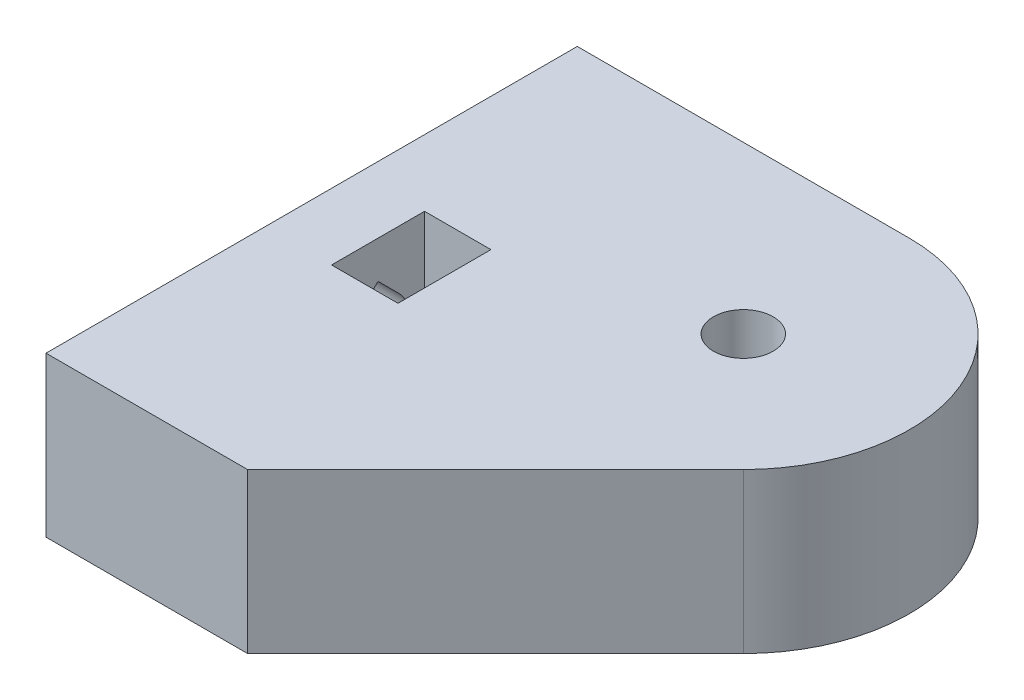
ISO-10303-21;
HEADER;
FILE_DESCRIPTION(('STEP AP214'),'2;1');
FILE_NAME('part.step','',(''),(''),'','','');
FILE_SCHEMA(('AUTOMOTIVE_DESIGN { 1 0 10303 214 1 1 1 1 }'));
ENDSEC;
DATA;
#1=APPLICATION_CONTEXT('core data for automotive mechanical design processes');
#2=APPLICATION_PROTOCOL_DEFINITION('international standard','automotive_design',2000,#1);
#3=PRODUCT_CONTEXT('',#1,'mechanical');
#4=PRODUCT('Part','Part','',(#3));
#5=PRODUCT_RELATED_PRODUCT_CATEGORY('part','',(#4));
#6=PRODUCT_DEFINITION_FORMATION('','',#4);
#7=PRODUCT_DEFINITION_CONTEXT('part definition',#1,'design');
#8=PRODUCT_DEFINITION('design','',#6,#7);
#9=PRODUCT_DEFINITION_SHAPE('','',#8);
#10=(LENGTH_UNIT() NAMED_UNIT(*) SI_UNIT(.MILLI.,.METRE.));
#11=(NAMED_UNIT(*) PLANE_ANGLE_UNIT() SI_UNIT($,.RADIAN.));
#12=(NAMED_UNIT(*) SI_UNIT($,.STERADIAN.) SOLID_ANGLE_UNIT());
#13=UNCERTAINTY_MEASURE_WITH_UNIT(LENGTH_MEASURE(1.E-05),#10,'distance_accuracy_value','');
#14=(GEOMETRIC_REPRESENTATION_CONTEXT(3) GLOBAL_UNCERTAINTY_ASSIGNED_CONTEXT((#13)) GLOBAL_UNIT_ASSIGNED_CONTEXT((#10,
#11,#12)) REPRESENTATION_CONTEXT('',''));
#15=CARTESIAN_POINT('',(0.,0.,0.));
#16=DIRECTION('',(0.,0.,1.));
#17=DIRECTION('',(1.,0.,0.));
#18=AXIS2_PLACEMENT_3D('',#15,#16,#17);
#19=CARTESIAN_POINT('',(-5.,6.,7.5));
#20=DIRECTION('',(-1.,0.,0.));
#21=DIRECTION('',(0.,0.,1.));
#22=AXIS2_PLACEMENT_3D('',#19,#20,#21);
#23=CYLINDRICAL_SURFACE('',#22,2.25);
#24=DIRECTION('',(-1.,0.,0.));
#25=VECTOR('',#24,1.);
#26=CARTESIAN_POINT('',(-5.,7.59099025766973,9.09099025766973));
#27=LINE('',#26,#25);
#28=CARTESIAN_POINT('',(-20.,7.59099025766973,9.09099025766973));
#29=VERTEX_POINT('',#28);
#30=CARTESIAN_POINT('',(-25.,7.59099025766973,9.09099025766973));
#31=VERTEX_POINT('',#30);
#32=EDGE_CURVE('E198',#29,#31,#27,.T.);
#33=ORIENTED_EDGE('',*,*,#32,.F.);
#34=CARTESIAN_POINT('',(-20.,6.,7.5));
#35=DIRECTION('',(-1.,0.,0.));
#36=DIRECTION('',(0.,0.,1.));
#37=AXIS2_PLACEMENT_3D('',#34,#35,#36);
#38=CIRCLE('',#37,2.25);
#39=CARTESIAN_POINT('',(-20.,7.59099025766973,5.90900974233027));
#40=VERTEX_POINT('',#39);
#41=EDGE_CURVE('E168',#40,#29,#38,.T.);
#42=ORIENTED_EDGE('',*,*,#41,.F.);
#43=DIRECTION('',(-1.,0.,0.));
#44=VECTOR('',#43,1.);
#45=CARTESIAN_POINT('',(-5.,7.59099025766973,5.90900974233027));
#46=LINE('',#45,#44);
#47=CARTESIAN_POINT('',(-25.,7.59099025766973,5.90900974233027));
#48=VERTEX_POINT('',#47);
#49=EDGE_CURVE('E210',#40,#48,#46,.T.);
#50=ORIENTED_EDGE('',*,*,#49,.T.);
#51=CARTESIAN_POINT('',(-25.,6.,7.5));
#52=DIRECTION('',(-1.,0.,0.));
#53=DIRECTION('',(0.,0.,1.));
#54=AXIS2_PLACEMENT_3D('',#51,#52,#53);
#55=CIRCLE('',#54,2.25);
#56=EDGE_CURVE('E187',#48,#31,#55,.T.);
#57=ORIENTED_EDGE('',*,*,#56,.T.);
#58=EDGE_LOOP('',(#33,#42,#50,#57));
#59=FACE_BOUND('',#58,.T.);
#60=ADVANCED_FACE('F32',(#59),#23,.F.);
#61=CARTESIAN_POINT('',(-5.,7.59099025766973,5.90900974233027));
#62=DIRECTION('',(0.,0.707106781186547,-0.707106781186548));
#63=DIRECTION('',(0.,0.707106781186548,0.707106781186547));
#64=AXIS2_PLACEMENT_3D('',#61,#62,#63);
#65=PLANE('',#64);
#66=ORIENTED_EDGE('',*,*,#49,.F.);
#67=DIRECTION('',(0.,-0.707106781186548,-0.707106781186547));
#68=VECTOR('',#67,1.);
#69=CARTESIAN_POINT('',(-20.,2.84049025766973,1.15850974233027));
#70=LINE('',#69,#68);
#71=CARTESIAN_POINT('',(-20.,9.18198051533946,7.5));
#72=VERTEX_POINT('',#71);
#73=EDGE_CURVE('E162',#72,#40,#70,.T.);
#74=ORIENTED_EDGE('',*,*,#73,.F.);
#75=DIRECTION('',(-1.,0.,0.));
#76=VECTOR('',#75,1.);
#77=CARTESIAN_POINT('',(-5.,9.18198051533946,7.5));
#78=LINE('',#77,#76);
#79=CARTESIAN_POINT('',(-25.,9.18198051533946,7.5));
#80=VERTEX_POINT('',#79);
#81=EDGE_CURVE('E214',#72,#80,#78,.T.);
#82=ORIENTED_EDGE('',*,*,#81,.T.);
#83=DIRECTION('',(0.,-0.707106781186548,-0.707106781186547));
#84=VECTOR('',#83,1.);
#85=CARTESIAN_POINT('',(-25.,7.59099025766973,5.90900974233027));
#86=LINE('',#85,#84);
#87=EDGE_CURVE('E192',#80,#48,#86,.T.);
#88=ORIENTED_EDGE('',*,*,#87,.T.);
#89=EDGE_LOOP('',(#66,#74,#82,#88));
#90=FACE_BOUND('',#89,.T.);
#91=ADVANCED_FACE('F287',(#90),#65,.F.);
#92=CARTESIAN_POINT('',(-5.,9.18198051533946,7.5));
#93=DIRECTION('',(0.,0.707106781186547,0.707106781186548));
#94=DIRECTION('',(0.,-0.707106781186548,0.707106781186547));
#95=AXIS2_PLACEMENT_3D('',#92,#93,#94);
#96=PLANE('',#95);
#97=ORIENTED_EDGE('',*,*,#81,.F.);
#98=DIRECTION('',(0.,0.707106781186548,-0.707106781186547));
#99=VECTOR('',#98,1.);
#100=CARTESIAN_POINT('',(-20.,6.34049025766972,10.3414902576697));
#101=LINE('',#100,#99);
#102=EDGE_CURVE('E160',#29,#72,#101,.T.);
#103=ORIENTED_EDGE('',*,*,#102,.F.);
#104=ORIENTED_EDGE('',*,*,#32,.T.);
#105=DIRECTION('',(0.,0.707106781186548,-0.707106781186547));
#106=VECTOR('',#105,1.);
#107=CARTESIAN_POINT('',(-25.,9.18198051533946,7.5));
#108=LINE('',#107,#106);
#109=EDGE_CURVE('E201',#31,#80,#108,.T.);
#110=ORIENTED_EDGE('',*,*,#109,.T.);
#111=EDGE_LOOP('',(#97,#103,#104,#110));
#112=FACE_BOUND('',#111,.T.);
#113=ADVANCED_FACE('F294',(#112),#96,.F.);
#114=CARTESIAN_POINT('',(0.,12.,0.));
#115=DIRECTION('',(0.,1.,0.));
#116=DIRECTION('',(0.,0.,1.));
#117=AXIS2_PLACEMENT_3D('',#114,#115,#116);
#118=PLANE('',#117);
#119=DIRECTION('',(0.,0.,1.));
#120=VECTOR('',#119,1.);
#121=CARTESIAN_POINT('',(-20.,12.,4.00000000000001));
#122=LINE('',#121,#120);
#123=CARTESIAN_POINT('',(-20.,12.,4.00000000000001));
#124=VERTEX_POINT('',#123);
#125=CARTESIAN_POINT('',(-20.,12.,11.));
#126=VERTEX_POINT('',#125);
#127=EDGE_CURVE('E47',#124,#126,#122,.T.);
#128=ORIENTED_EDGE('',*,*,#127,.F.);
#129=DIRECTION('',(-1.,0.,0.));
#130=VECTOR('',#129,1.);
#131=CARTESIAN_POINT('',(-20.,12.,4.00000000000001));
#132=LINE('',#131,#130);
#133=CARTESIAN_POINT('',(-15.,12.,4.00000000000001));
#134=VERTEX_POINT('',#133);
#135=EDGE_CURVE('E147',#134,#124,#132,.T.);
#136=ORIENTED_EDGE('',*,*,#135,.F.);
#137=DIRECTION('',(0.,0.,-1.));
#138=VECTOR('',#137,1.);
#139=CARTESIAN_POINT('',(-15.,12.,4.00000000000001));
#140=LINE('',#139,#138);
#141=CARTESIAN_POINT('',(-15.,12.,11.));
#142=VERTEX_POINT('',#141);
#143=EDGE_CURVE('E173',#142,#134,#140,.T.);
#144=ORIENTED_EDGE('',*,*,#143,.F.);
#145=DIRECTION('',(1.,0.,0.));
#146=VECTOR('',#145,1.);
#147=CARTESIAN_POINT('',(-20.,12.,11.));
#148=LINE('',#147,#146);
#149=EDGE_CURVE('E171',#126,#142,#148,.T.);
#150=ORIENTED_EDGE('',*,*,#149,.F.);
#151=EDGE_LOOP('',(#128,#136,#144,#150));
#152=FACE_BOUND('',#151,.T.);
#153=CARTESIAN_POINT('',(0.,12.,0.));
#154=DIRECTION('',(0.,1.,0.));
#155=DIRECTION('',(0.,0.,1.));
#156=AXIS2_PLACEMENT_3D('',#153,#154,#155);
#157=CIRCLE('',#156,12.5);
#158=CARTESIAN_POINT('',(8.83883476483186,12.,8.83883476483183));
#159=VERTEX_POINT('',#158);
#160=CARTESIAN_POINT('',(0.,12.,-12.5));
#161=VERTEX_POINT('',#160);
#162=EDGE_CURVE('E224',#159,#161,#157,.T.);
#163=ORIENTED_EDGE('',*,*,#162,.T.);
#164=DIRECTION('',(-1.,0.,0.));
#165=VECTOR('',#164,1.);
#166=CARTESIAN_POINT('',(0.,12.,-12.5));
#167=LINE('',#166,#165);
#168=CARTESIAN_POINT('',(-25.,12.,-12.5));
#169=VERTEX_POINT('',#168);
#170=EDGE_CURVE('E227',#161,#169,#167,.T.);
#171=ORIENTED_EDGE('',*,*,#170,.T.);
#172=DIRECTION('',(0.,0.,1.));
#173=VECTOR('',#172,1.);
#174=CARTESIAN_POINT('',(-25.,12.,-12.5));
#175=LINE('',#174,#173);
#176=CARTESIAN_POINT('',(-25.,12.,27.5));
#177=VERTEX_POINT('',#176);
#178=EDGE_CURVE('E230',#169,#177,#175,.T.);
#179=ORIENTED_EDGE('',*,*,#178,.T.);
#180=DIRECTION('',(1.,0.,0.));
#181=VECTOR('',#180,1.);
#182=CARTESIAN_POINT('',(-25.,12.,27.5));
#183=LINE('',#182,#181);
#184=CARTESIAN_POINT('',(-9.82233047033624,12.,27.5));
#185=VERTEX_POINT('',#184);
#186=EDGE_CURVE('E232',#177,#185,#183,.T.);
#187=ORIENTED_EDGE('',*,*,#186,.T.);
#188=DIRECTION('',(0.707106781186546,0.,-0.707106781186549));
#189=VECTOR('',#188,1.);
#190=CARTESIAN_POINT('',(-9.82233047033624,12.,27.5));
#191=LINE('',#190,#189);
#192=EDGE_CURVE('E234',#185,#159,#191,.T.);
#193=ORIENTED_EDGE('',*,*,#192,.T.);
#194=EDGE_LOOP('',(#163,#171,#179,#187,#193));
#195=FACE_BOUND('',#194,.T.);
#196=CARTESIAN_POINT('',(0.,12.,0.));
#197=DIRECTION('',(0.,1.,0.));
#198=DIRECTION('',(0.,0.,1.));
#199=AXIS2_PLACEMENT_3D('',#196,#197,#198);
#200=CIRCLE('',#199,2.25);
#201=CARTESIAN_POINT('',(0.,12.,2.25));
#202=VERTEX_POINT('',#201);
#203=EDGE_CURVE('E218',#202,#202,#200,.T.);
#204=ORIENTED_EDGE('',*,*,#203,.F.);
#205=EDGE_LOOP('',(#204));
#206=FACE_BOUND('',#205,.T.);
#207=ADVANCED_FACE('F275',(#152,#195,#206),#118,.T.);
#208=CARTESIAN_POINT('',(0.,0.,0.));
#209=DIRECTION('',(0.,1.,0.));
#210=DIRECTION('',(0.,0.,1.));
#211=AXIS2_PLACEMENT_3D('',#208,#209,#210);
#212=PLANE('',#211);
#213=DIRECTION('',(1.,0.,0.));
#214=VECTOR('',#213,1.);
#215=CARTESIAN_POINT('',(-20.,0.,4.00000000000001));
#216=LINE('',#215,#214);
#217=CARTESIAN_POINT('',(-20.,0.,4.00000000000001));
#218=VERTEX_POINT('',#217);
#219=CARTESIAN_POINT('',(-15.,0.,4.00000000000001));
#220=VERTEX_POINT('',#219);
#221=EDGE_CURVE('E159',#218,#220,#216,.T.);
#222=ORIENTED_EDGE('',*,*,#221,.F.);
#223=DIRECTION('',(0.,0.,-1.));
#224=VECTOR('',#223,1.);
#225=CARTESIAN_POINT('',(-20.,0.,4.00000000000001));
#226=LINE('',#225,#224);
#227=CARTESIAN_POINT('',(-20.,0.,11.));
#228=VERTEX_POINT('',#227);
#229=EDGE_CURVE('E141',#228,#218,#226,.T.);
#230=ORIENTED_EDGE('',*,*,#229,.F.);
#231=DIRECTION('',(-1.,0.,0.));
#232=VECTOR('',#231,1.);
#233=CARTESIAN_POINT('',(-20.,0.,11.));
#234=LINE('',#233,#232);
#235=CARTESIAN_POINT('',(-15.,0.,11.));
#236=VERTEX_POINT('',#235);
#237=EDGE_CURVE('E150',#236,#228,#234,.T.);
#238=ORIENTED_EDGE('',*,*,#237,.F.);
#239=DIRECTION('',(0.,0.,1.));
#240=VECTOR('',#239,1.);
#241=CARTESIAN_POINT('',(-15.,0.,4.00000000000001));
#242=LINE('',#241,#240);
#243=EDGE_CURVE('E55',#220,#236,#242,.T.);
#244=ORIENTED_EDGE('',*,*,#243,.F.);
#245=EDGE_LOOP('',(#222,#230,#238,#244));
#246=FACE_BOUND('',#245,.T.);
#247=CARTESIAN_POINT('',(0.,0.,0.));
#248=DIRECTION('',(0.,1.,0.));
#249=DIRECTION('',(0.,0.,1.));
#250=AXIS2_PLACEMENT_3D('',#247,#248,#249);
#251=CIRCLE('',#250,12.5);
#252=CARTESIAN_POINT('',(8.83883476483186,0.,8.83883476483183));
#253=VERTEX_POINT('',#252);
#254=CARTESIAN_POINT('',(0.,0.,-12.5));
#255=VERTEX_POINT('',#254);
#256=EDGE_CURVE('E221',#253,#255,#251,.T.);
#257=ORIENTED_EDGE('',*,*,#256,.F.);
#258=DIRECTION('',(0.707106781186546,0.,-0.707106781186549));
#259=VECTOR('',#258,1.);
#260=CARTESIAN_POINT('',(-9.82233047033624,0.,27.5));
#261=LINE('',#260,#259);
#262=CARTESIAN_POINT('',(-9.82233047033624,0.,27.5));
#263=VERTEX_POINT('',#262);
#264=EDGE_CURVE('E228',#263,#253,#261,.T.);
#265=ORIENTED_EDGE('',*,*,#264,.F.);
#266=DIRECTION('',(1.,0.,0.));
#267=VECTOR('',#266,1.);
#268=CARTESIAN_POINT('',(-25.,0.,27.5));
#269=LINE('',#268,#267);
#270=CARTESIAN_POINT('',(-25.,0.,27.5));
#271=VERTEX_POINT('',#270);
#272=EDGE_CURVE('E243',#271,#263,#269,.T.);
#273=ORIENTED_EDGE('',*,*,#272,.F.);
#274=DIRECTION('',(0.,0.,1.));
#275=VECTOR('',#274,1.);
#276=CARTESIAN_POINT('',(-25.,0.,-12.5));
#277=LINE('',#276,#275);
#278=CARTESIAN_POINT('',(-25.,0.,-12.5));
#279=VERTEX_POINT('',#278);
#280=EDGE_CURVE('E241',#279,#271,#277,.T.);
#281=ORIENTED_EDGE('',*,*,#280,.F.);
#282=DIRECTION('',(-1.,0.,0.));
#283=VECTOR('',#282,1.);
#284=CARTESIAN_POINT('',(-15.,0.,-12.5));
#285=LINE('',#284,#283);
#286=EDGE_CURVE('E239',#255,#279,#285,.T.);
#287=ORIENTED_EDGE('',*,*,#286,.F.);
#288=EDGE_LOOP('',(#257,#265,#273,#281,#287));
#289=FACE_BOUND('',#288,.T.);
#290=CARTESIAN_POINT('',(0.,0.,0.));
#291=DIRECTION('',(0.,1.,0.));
#292=DIRECTION('',(0.,0.,1.));
#293=AXIS2_PLACEMENT_3D('',#290,#291,#292);
#294=CIRCLE('',#293,2.25);
#295=CARTESIAN_POINT('',(0.,0.,2.25));
#296=VERTEX_POINT('',#295);
#297=EDGE_CURVE('E209',#296,#296,#294,.T.);
#298=ORIENTED_EDGE('',*,*,#297,.T.);
#299=EDGE_LOOP('',(#298));
#300=FACE_BOUND('',#299,.T.);
#301=ADVANCED_FACE('F156',(#246,#289,#300),#212,.F.);
#302=CARTESIAN_POINT('',(0.,12.,0.));
#303=DIRECTION('',(0.,-1.,0.));
#304=DIRECTION('',(0.,0.,-1.));
#305=AXIS2_PLACEMENT_3D('',#302,#303,#304);
#306=CYLINDRICAL_SURFACE('',#305,12.5);
#307=ORIENTED_EDGE('',*,*,#256,.T.);
#308=DIRECTION('',(0.,-1.,0.));
#309=VECTOR('',#308,1.);
#310=CARTESIAN_POINT('',(0.,12.,-12.5));
#311=LINE('',#310,#309);
#312=EDGE_CURVE('E11',#161,#255,#311,.T.);
#313=ORIENTED_EDGE('',*,*,#312,.F.);
#314=ORIENTED_EDGE('',*,*,#162,.F.);
#315=DIRECTION('',(0.,-1.,0.));
#316=VECTOR('',#315,1.);
#317=CARTESIAN_POINT('',(8.83883476483186,12.,8.83883476483183));
#318=LINE('',#317,#316);
#319=EDGE_CURVE('E236',#159,#253,#318,.T.);
#320=ORIENTED_EDGE('',*,*,#319,.T.);
#321=EDGE_LOOP('',(#307,#313,#314,#320));
#322=FACE_BOUND('',#321,.T.);
#323=ADVANCED_FACE('F34',(#322),#306,.T.);
#324=CARTESIAN_POINT('',(-15.,12.,-12.5));
#325=DIRECTION('',(0.,0.,1.));
#326=DIRECTION('',(1.,0.,0.));
#327=AXIS2_PLACEMENT_3D('',#324,#325,#326);
#328=PLANE('',#327);
#329=ORIENTED_EDGE('',*,*,#286,.T.);
#330=DIRECTION('',(0.,-1.,0.));
#331=VECTOR('',#330,1.);
#332=CARTESIAN_POINT('',(-25.,12.,-12.5));
#333=LINE('',#332,#331);
#334=EDGE_CURVE('E40',#169,#279,#333,.T.);
#335=ORIENTED_EDGE('',*,*,#334,.F.);
#336=ORIENTED_EDGE('',*,*,#170,.F.);
#337=ORIENTED_EDGE('',*,*,#312,.T.);
#338=EDGE_LOOP('',(#329,#335,#336,#337));
#339=FACE_BOUND('',#338,.T.);
#340=ADVANCED_FACE('F278',(#339),#328,.F.);
#341=CARTESIAN_POINT('',(-25.,12.,-12.5));
#342=DIRECTION('',(1.,0.,0.));
#343=DIRECTION('',(0.,0.,-1.));
#344=AXIS2_PLACEMENT_3D('',#341,#342,#343);
#345=PLANE('',#344);
#346=ORIENTED_EDGE('',*,*,#109,.F.);
#347=ORIENTED_EDGE('',*,*,#56,.F.);
#348=ORIENTED_EDGE('',*,*,#87,.F.);
#349=EDGE_LOOP('',(#346,#347,#348));
#350=FACE_BOUND('',#349,.T.);
#351=ORIENTED_EDGE('',*,*,#280,.T.);
#352=DIRECTION('',(0.,-1.,0.));
#353=VECTOR('',#352,1.);
#354=CARTESIAN_POINT('',(-25.,12.,27.5));
#355=LINE('',#354,#353);
#356=EDGE_CURVE('E251',#177,#271,#355,.T.);
#357=ORIENTED_EDGE('',*,*,#356,.F.);
#358=ORIENTED_EDGE('',*,*,#178,.F.);
#359=ORIENTED_EDGE('',*,*,#334,.T.);
#360=EDGE_LOOP('',(#351,#357,#358,#359));
#361=FACE_BOUND('',#360,.T.);
#362=ADVANCED_FACE('F258',(#350,#361),#345,.F.);
#363=CARTESIAN_POINT('',(-25.,12.,27.5));
#364=DIRECTION('',(0.,0.,-1.));
#365=DIRECTION('',(-1.,0.,0.));
#366=AXIS2_PLACEMENT_3D('',#363,#364,#365);
#367=PLANE('',#366);
#368=ORIENTED_EDGE('',*,*,#272,.T.);
#369=DIRECTION('',(0.,-1.,0.));
#370=VECTOR('',#369,1.);
#371=CARTESIAN_POINT('',(-9.82233047033624,12.,27.5));
#372=LINE('',#371,#370);
#373=EDGE_CURVE('E248',#185,#263,#372,.T.);
#374=ORIENTED_EDGE('',*,*,#373,.F.);
#375=ORIENTED_EDGE('',*,*,#186,.F.);
#376=ORIENTED_EDGE('',*,*,#356,.T.);
#377=EDGE_LOOP('',(#368,#374,#375,#376));
#378=FACE_BOUND('',#377,.T.);
#379=ADVANCED_FACE('F267',(#378),#367,.F.);
#380=CARTESIAN_POINT('',(-9.82233047033624,12.,27.5));
#381=DIRECTION('',(-0.707106781186549,0.,-0.707106781186546));
#382=DIRECTION('',(-0.707106781186546,0.,0.707106781186549));
#383=AXIS2_PLACEMENT_3D('',#380,#381,#382);
#384=PLANE('',#383);
#385=ORIENTED_EDGE('',*,*,#264,.T.);
#386=ORIENTED_EDGE('',*,*,#319,.F.);
#387=ORIENTED_EDGE('',*,*,#192,.F.);
#388=ORIENTED_EDGE('',*,*,#373,.T.);
#389=EDGE_LOOP('',(#385,#386,#387,#388));
#390=FACE_BOUND('',#389,.T.);
#391=ADVANCED_FACE('F271',(#390),#384,.F.);
#392=CARTESIAN_POINT('',(0.,12.,0.));
#393=DIRECTION('',(0.,-1.,0.));
#394=DIRECTION('',(0.,0.,-1.));
#395=AXIS2_PLACEMENT_3D('',#392,#393,#394);
#396=CYLINDRICAL_SURFACE('',#395,2.25);
#397=ORIENTED_EDGE('',*,*,#203,.T.);
#398=EDGE_LOOP('',(#397));
#399=FACE_BOUND('',#398,.T.);
#400=ORIENTED_EDGE('',*,*,#297,.F.);
#401=EDGE_LOOP('',(#400));
#402=FACE_BOUND('',#401,.T.);
#403=ADVANCED_FACE('F329',(#399,#402),#396,.F.);
#404=CARTESIAN_POINT('',(-20.,-0.000999999999999265,4.00000000000001));
#405=DIRECTION('',(-1.,0.,0.));
#406=DIRECTION('',(0.,0.,1.));
#407=AXIS2_PLACEMENT_3D('',#404,#405,#406);
#408=PLANE('',#407);
#409=ORIENTED_EDGE('',*,*,#41,.T.);
#410=ORIENTED_EDGE('',*,*,#102,.T.);
#411=ORIENTED_EDGE('',*,*,#73,.T.);
#412=EDGE_LOOP('',(#409,#410,#411));
#413=FACE_BOUND('',#412,.T.);
#414=ORIENTED_EDGE('',*,*,#229,.T.);
#415=DIRECTION('',(0.,1.,0.));
#416=VECTOR('',#415,1.);
#417=CARTESIAN_POINT('',(-20.,-0.000999999999999265,4.00000000000001));
#418=LINE('',#417,#416);
#419=EDGE_CURVE('E154',#218,#124,#418,.T.);
#420=ORIENTED_EDGE('',*,*,#419,.T.);
#421=ORIENTED_EDGE('',*,*,#127,.T.);
#422=DIRECTION('',(0.,1.,0.));
#423=VECTOR('',#422,1.);
#424=CARTESIAN_POINT('',(-20.,-0.000999999999999265,11.));
#425=LINE('',#424,#423);
#426=EDGE_CURVE('E137',#228,#126,#425,.T.);
#427=ORIENTED_EDGE('',*,*,#426,.F.);
#428=EDGE_LOOP('',(#414,#420,#421,#427));
#429=FACE_BOUND('',#428,.T.);
#430=ADVANCED_FACE('F139',(#413,#429),#408,.F.);
#431=CARTESIAN_POINT('',(-20.,-0.000999999999999265,4.00000000000001));
#432=DIRECTION('',(0.,0.,-1.));
#433=DIRECTION('',(-1.,0.,0.));
#434=AXIS2_PLACEMENT_3D('',#431,#432,#433);
#435=PLANE('',#434);
#436=ORIENTED_EDGE('',*,*,#221,.T.);
#437=DIRECTION('',(0.,1.,0.));
#438=VECTOR('',#437,1.);
#439=CARTESIAN_POINT('',(-15.,-0.000999999999999265,4.00000000000001));
#440=LINE('',#439,#438);
#441=EDGE_CURVE('E179',#220,#134,#440,.T.);
#442=ORIENTED_EDGE('',*,*,#441,.T.);
#443=ORIENTED_EDGE('',*,*,#135,.T.);
#444=ORIENTED_EDGE('',*,*,#419,.F.);
#445=EDGE_LOOP('',(#436,#442,#443,#444));
#446=FACE_BOUND('',#445,.T.);
#447=ADVANCED_FACE('F328',(#446),#435,.F.);
#448=CARTESIAN_POINT('',(-15.,-0.000999999999999265,4.00000000000001));
#449=DIRECTION('',(1.,0.,0.));
#450=DIRECTION('',(0.,0.,-1.));
#451=AXIS2_PLACEMENT_3D('',#448,#449,#450);
#452=PLANE('',#451);
#453=CARTESIAN_POINT('',(-15.,6.,7.5));
#454=DIRECTION('',(1.,0.,0.));
#455=DIRECTION('',(0.,0.,-1.));
#456=AXIS2_PLACEMENT_3D('',#453,#454,#455);
#457=CIRCLE('',#456,2.25);
#458=CARTESIAN_POINT('',(-15.,7.59099025766973,9.09099025766973));
#459=VERTEX_POINT('',#458);
#460=CARTESIAN_POINT('',(-15.,7.59099025766973,5.90900974233027));
#461=VERTEX_POINT('',#460);
#462=EDGE_CURVE('E185',#459,#461,#457,.T.);
#463=ORIENTED_EDGE('',*,*,#462,.T.);
#464=DIRECTION('',(0.,0.707106781186548,0.707106781186547));
#465=VECTOR('',#464,1.);
#466=CARTESIAN_POINT('',(-15.,2.84049025766973,1.15850974233027));
#467=LINE('',#466,#465);
#468=CARTESIAN_POINT('',(-15.,9.18198051533946,7.5));
#469=VERTEX_POINT('',#468);
#470=EDGE_CURVE('E183',#461,#469,#467,.T.);
#471=ORIENTED_EDGE('',*,*,#470,.T.);
#472=DIRECTION('',(0.,-0.707106781186548,0.707106781186547));
#473=VECTOR('',#472,1.);
#474=CARTESIAN_POINT('',(-15.,6.34049025766972,10.3414902576697));
#475=LINE('',#474,#473);
#476=EDGE_CURVE('E153',#469,#459,#475,.T.);
#477=ORIENTED_EDGE('',*,*,#476,.T.);
#478=EDGE_LOOP('',(#463,#471,#477));
#479=FACE_BOUND('',#478,.T.);
#480=ORIENTED_EDGE('',*,*,#243,.T.);
#481=DIRECTION('',(0.,1.,0.));
#482=VECTOR('',#481,1.);
#483=CARTESIAN_POINT('',(-15.,-0.000999999999999265,11.));
#484=LINE('',#483,#482);
#485=EDGE_CURVE('E146',#236,#142,#484,.T.);
#486=ORIENTED_EDGE('',*,*,#485,.T.);
#487=ORIENTED_EDGE('',*,*,#143,.T.);
#488=ORIENTED_EDGE('',*,*,#441,.F.);
#489=EDGE_LOOP('',(#480,#486,#487,#488));
#490=FACE_BOUND('',#489,.T.);
#491=ADVANCED_FACE('F314',(#479,#490),#452,.F.);
#492=CARTESIAN_POINT('',(-20.,-0.000999999999999265,11.));
#493=DIRECTION('',(0.,0.,1.));
#494=DIRECTION('',(1.,0.,0.));
#495=AXIS2_PLACEMENT_3D('',#492,#493,#494);
#496=PLANE('',#495);
#497=ORIENTED_EDGE('',*,*,#237,.T.);
#498=ORIENTED_EDGE('',*,*,#426,.T.);
#499=ORIENTED_EDGE('',*,*,#149,.T.);
#500=ORIENTED_EDGE('',*,*,#485,.F.);
#501=EDGE_LOOP('',(#497,#498,#499,#500));
#502=FACE_BOUND('',#501,.T.);
#503=ADVANCED_FACE('F151',(#502),#496,.F.);
#504=CARTESIAN_POINT('',(-5.,6.,7.5));
#505=DIRECTION('',(-1.,0.,0.));
#506=DIRECTION('',(0.,0.,1.));
#507=AXIS2_PLACEMENT_3D('',#504,#505,#506);
#508=PLANE('',#507);
#509=CARTESIAN_POINT('',(-5.,6.,7.5));
#510=DIRECTION('',(-1.,0.,0.));
#511=DIRECTION('',(0.,0.,1.));
#512=AXIS2_PLACEMENT_3D('',#509,#510,#511);
#513=CIRCLE('',#512,2.25);
#514=CARTESIAN_POINT('',(-5.,7.59099025766973,5.90900974233027));
#515=VERTEX_POINT('',#514);
#516=CARTESIAN_POINT('',(-5.,7.59099025766973,9.09099025766973));
#517=VERTEX_POINT('',#516);
#518=EDGE_CURVE('E188',#515,#517,#513,.T.);
#519=ORIENTED_EDGE('',*,*,#518,.T.);
#520=DIRECTION('',(0.,0.707106781186548,-0.707106781186547));
#521=VECTOR('',#520,1.);
#522=CARTESIAN_POINT('',(-5.,9.18198051533946,7.5));
#523=LINE('',#522,#521);
#524=CARTESIAN_POINT('',(-5.,9.18198051533946,7.5));
#525=VERTEX_POINT('',#524);
#526=EDGE_CURVE('E191',#517,#525,#523,.T.);
#527=ORIENTED_EDGE('',*,*,#526,.T.);
#528=DIRECTION('',(0.,-0.707106781186548,-0.707106781186547));
#529=VECTOR('',#528,1.);
#530=CARTESIAN_POINT('',(-5.,7.59099025766973,5.90900974233027));
#531=LINE('',#530,#529);
#532=EDGE_CURVE('E195',#525,#515,#531,.T.);
#533=ORIENTED_EDGE('',*,*,#532,.T.);
#534=EDGE_LOOP('',(#519,#527,#533));
#535=FACE_BOUND('',#534,.T.);
#536=ADVANCED_FACE('F318',(#535),#508,.T.);
#537=EDGE_CURVE('E215',#517,#459,#27,.T.);
#538=ORIENTED_EDGE('',*,*,#537,.T.);
#539=ORIENTED_EDGE('',*,*,#476,.F.);
#540=EDGE_CURVE('E211',#525,#469,#78,.T.);
#541=ORIENTED_EDGE('',*,*,#540,.F.);
#542=ORIENTED_EDGE('',*,*,#526,.F.);
#543=EDGE_LOOP('',(#538,#539,#541,#542));
#544=FACE_BOUND('',#543,.T.);
#545=ADVANCED_FACE('F306',(#544),#96,.F.);
#546=ORIENTED_EDGE('',*,*,#540,.T.);
#547=ORIENTED_EDGE('',*,*,#470,.F.);
#548=EDGE_CURVE('E206',#515,#461,#46,.T.);
#549=ORIENTED_EDGE('',*,*,#548,.F.);
#550=ORIENTED_EDGE('',*,*,#532,.F.);
#551=EDGE_LOOP('',(#546,#547,#549,#550));
#552=FACE_BOUND('',#551,.T.);
#553=ADVANCED_FACE('F297',(#552),#65,.F.);
#554=ORIENTED_EDGE('',*,*,#548,.T.);
#555=ORIENTED_EDGE('',*,*,#462,.F.);
#556=ORIENTED_EDGE('',*,*,#537,.F.);
#557=ORIENTED_EDGE('',*,*,#518,.F.);
#558=EDGE_LOOP('',(#554,#555,#556,#557));
#559=FACE_BOUND('',#558,.T.);
#560=ADVANCED_FACE('F290',(#559),#23,.F.);
#561=CLOSED_SHELL('',(#60,#91,#113,#207,#301,#323,#340,#362,#379,#391,#403,#430,#447,#491,#503,
#536,#545,#553,#560));
#562=MANIFOLD_SOLID_BREP('B2',#561);
#563=ADVANCED_BREP_SHAPE_REPRESENTATION('',(#18,#562),#14);
#564=SHAPE_DEFINITION_REPRESENTATION(#9,#563);
ENDSEC;
END-ISO-10303-21;
